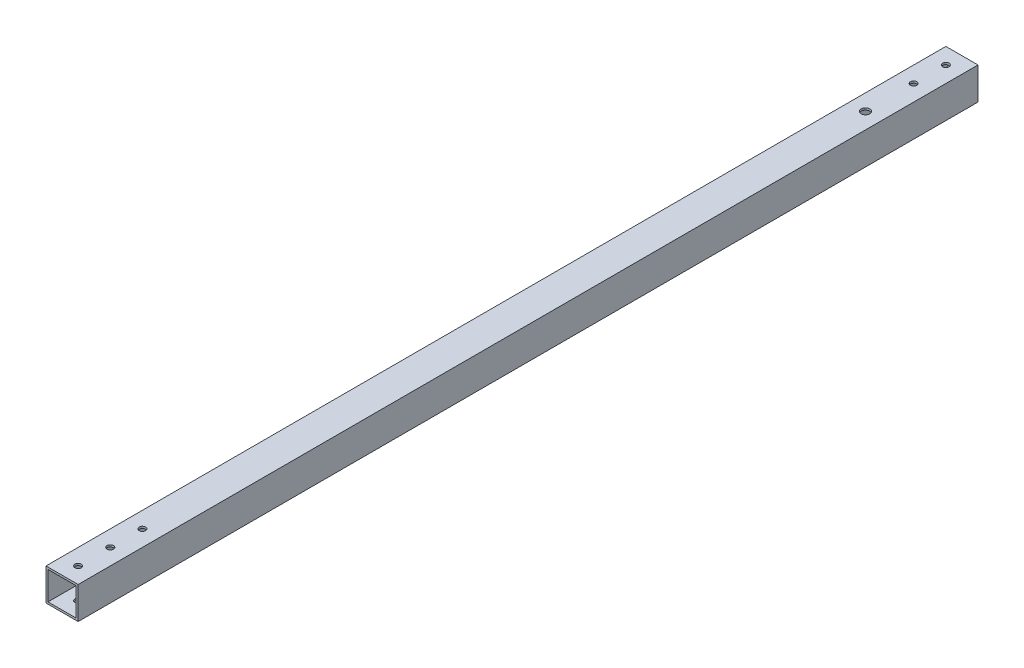
ISO-10303-21;
HEADER;
FILE_DESCRIPTION(('STEP AP214'),'2;1');
FILE_NAME('part.step','',(''),(''),'','','');
FILE_SCHEMA(('AUTOMOTIVE_DESIGN { 1 0 10303 214 1 1 1 1 }'));
ENDSEC;
DATA;
#1=APPLICATION_CONTEXT('core data for automotive mechanical design processes');
#2=APPLICATION_PROTOCOL_DEFINITION('international standard','automotive_design',2000,#1);
#3=PRODUCT_CONTEXT('',#1,'mechanical');
#4=PRODUCT('Part','Part','',(#3));
#5=PRODUCT_RELATED_PRODUCT_CATEGORY('part','',(#4));
#6=PRODUCT_DEFINITION_FORMATION('','',#4);
#7=PRODUCT_DEFINITION_CONTEXT('part definition',#1,'design');
#8=PRODUCT_DEFINITION('design','',#6,#7);
#9=PRODUCT_DEFINITION_SHAPE('','',#8);
#10=(LENGTH_UNIT() NAMED_UNIT(*) SI_UNIT(.MILLI.,.METRE.));
#11=(NAMED_UNIT(*) PLANE_ANGLE_UNIT() SI_UNIT($,.RADIAN.));
#12=(NAMED_UNIT(*) SI_UNIT($,.STERADIAN.) SOLID_ANGLE_UNIT());
#13=UNCERTAINTY_MEASURE_WITH_UNIT(LENGTH_MEASURE(1.E-05),#10,'distance_accuracy_value','');
#14=(GEOMETRIC_REPRESENTATION_CONTEXT(3) GLOBAL_UNCERTAINTY_ASSIGNED_CONTEXT((#13)) GLOBAL_UNIT_ASSIGNED_CONTEXT((#10,
#11,#12)) REPRESENTATION_CONTEXT('',''));
#15=CARTESIAN_POINT('',(0.,0.,0.));
#16=DIRECTION('',(0.,0.,1.));
#17=DIRECTION('',(1.,0.,0.));
#18=AXIS2_PLACEMENT_3D('',#15,#16,#17);
#19=CARTESIAN_POINT('',(0.,0.,711.2));
#20=DIRECTION('',(0.,0.,-1.));
#21=DIRECTION('',(-1.,0.,0.));
#22=AXIS2_PLACEMENT_3D('',#19,#20,#21);
#23=PLANE('',#22);
#24=DIRECTION('',(0.,-1.,0.));
#25=VECTOR('',#24,1.);
#26=CARTESIAN_POINT('',(0.,0.,711.2));
#27=LINE('',#26,#25);
#28=CARTESIAN_POINT('',(0.,25.4,711.2));
#29=VERTEX_POINT('',#28);
#30=CARTESIAN_POINT('',(0.,0.,711.2));
#31=VERTEX_POINT('',#30);
#32=EDGE_CURVE('E157',#29,#31,#27,.T.);
#33=ORIENTED_EDGE('',*,*,#32,.T.);
#34=DIRECTION('',(1.,0.,0.));
#35=VECTOR('',#34,1.);
#36=CARTESIAN_POINT('',(0.,0.,711.2));
#37=LINE('',#36,#35);
#38=CARTESIAN_POINT('',(25.4,0.,711.2));
#39=VERTEX_POINT('',#38);
#40=EDGE_CURVE('E161',#31,#39,#37,.T.);
#41=ORIENTED_EDGE('',*,*,#40,.T.);
#42=DIRECTION('',(0.,1.,0.));
#43=VECTOR('',#42,1.);
#44=CARTESIAN_POINT('',(25.4,0.,711.2));
#45=LINE('',#44,#43);
#46=CARTESIAN_POINT('',(25.4,25.4,711.2));
#47=VERTEX_POINT('',#46);
#48=EDGE_CURVE('E165',#39,#47,#45,.T.);
#49=ORIENTED_EDGE('',*,*,#48,.T.);
#50=DIRECTION('',(-1.,0.,0.));
#51=VECTOR('',#50,1.);
#52=CARTESIAN_POINT('',(0.,25.4,711.2));
#53=LINE('',#52,#51);
#54=EDGE_CURVE('E168',#47,#29,#53,.T.);
#55=ORIENTED_EDGE('',*,*,#54,.T.);
#56=EDGE_LOOP('',(#33,#41,#49,#55));
#57=FACE_BOUND('',#56,.T.);
#58=DIRECTION('',(0.,-1.,0.));
#59=VECTOR('',#58,1.);
#60=CARTESIAN_POINT('',(1.5875,1.5875,711.2));
#61=LINE('',#60,#59);
#62=CARTESIAN_POINT('',(1.5875,23.8125,711.2));
#63=VERTEX_POINT('',#62);
#64=CARTESIAN_POINT('',(1.5875,1.5875,711.2));
#65=VERTEX_POINT('',#64);
#66=EDGE_CURVE('E107',#63,#65,#61,.T.);
#67=ORIENTED_EDGE('',*,*,#66,.F.);
#68=DIRECTION('',(-1.,0.,0.));
#69=VECTOR('',#68,1.);
#70=CARTESIAN_POINT('',(1.5875,23.8125,711.2));
#71=LINE('',#70,#69);
#72=CARTESIAN_POINT('',(23.8125,23.8125,711.2));
#73=VERTEX_POINT('',#72);
#74=EDGE_CURVE('E133',#73,#63,#71,.T.);
#75=ORIENTED_EDGE('',*,*,#74,.F.);
#76=DIRECTION('',(0.,1.,0.));
#77=VECTOR('',#76,1.);
#78=CARTESIAN_POINT('',(23.8125,1.5875,711.2));
#79=LINE('',#78,#77);
#80=CARTESIAN_POINT('',(23.8125,1.5875,711.2));
#81=VERTEX_POINT('',#80);
#82=EDGE_CURVE('E129',#81,#73,#79,.T.);
#83=ORIENTED_EDGE('',*,*,#82,.F.);
#84=DIRECTION('',(1.,0.,0.));
#85=VECTOR('',#84,1.);
#86=CARTESIAN_POINT('',(1.5875,1.5875,711.2));
#87=LINE('',#86,#85);
#88=EDGE_CURVE('E116',#65,#81,#87,.T.);
#89=ORIENTED_EDGE('',*,*,#88,.F.);
#90=EDGE_LOOP('',(#67,#75,#83,#89));
#91=FACE_BOUND('',#90,.T.);
#92=ADVANCED_FACE('F39',(#57,#91),#23,.F.);
#93=CARTESIAN_POINT('',(0.,0.,0.));
#94=DIRECTION('',(0.,0.,-1.));
#95=DIRECTION('',(-1.,0.,0.));
#96=AXIS2_PLACEMENT_3D('',#93,#94,#95);
#97=PLANE('',#96);
#98=DIRECTION('',(0.,-1.,0.));
#99=VECTOR('',#98,1.);
#100=CARTESIAN_POINT('',(0.,0.,0.));
#101=LINE('',#100,#99);
#102=CARTESIAN_POINT('',(0.,25.4,0.));
#103=VERTEX_POINT('',#102);
#104=CARTESIAN_POINT('',(0.,0.,0.));
#105=VERTEX_POINT('',#104);
#106=EDGE_CURVE('E125',#103,#105,#101,.T.);
#107=ORIENTED_EDGE('',*,*,#106,.F.);
#108=DIRECTION('',(-1.,0.,0.));
#109=VECTOR('',#108,1.);
#110=CARTESIAN_POINT('',(0.,25.4,0.));
#111=LINE('',#110,#109);
#112=CARTESIAN_POINT('',(25.4,25.4,0.));
#113=VERTEX_POINT('',#112);
#114=EDGE_CURVE('E162',#113,#103,#111,.T.);
#115=ORIENTED_EDGE('',*,*,#114,.F.);
#116=DIRECTION('',(0.,1.,0.));
#117=VECTOR('',#116,1.);
#118=CARTESIAN_POINT('',(25.4,0.,0.));
#119=LINE('',#118,#117);
#120=CARTESIAN_POINT('',(25.4,0.,0.));
#121=VERTEX_POINT('',#120);
#122=EDGE_CURVE('E178',#121,#113,#119,.T.);
#123=ORIENTED_EDGE('',*,*,#122,.F.);
#124=DIRECTION('',(1.,0.,0.));
#125=VECTOR('',#124,1.);
#126=CARTESIAN_POINT('',(0.,0.,0.));
#127=LINE('',#126,#125);
#128=EDGE_CURVE('E175',#105,#121,#127,.T.);
#129=ORIENTED_EDGE('',*,*,#128,.F.);
#130=EDGE_LOOP('',(#107,#115,#123,#129));
#131=FACE_BOUND('',#130,.T.);
#132=DIRECTION('',(-1.,0.,0.));
#133=VECTOR('',#132,1.);
#134=CARTESIAN_POINT('',(1.5875,23.8125,0.));
#135=LINE('',#134,#133);
#136=CARTESIAN_POINT('',(23.8125,23.8125,0.));
#137=VERTEX_POINT('',#136);
#138=CARTESIAN_POINT('',(1.5875,23.8125,0.));
#139=VERTEX_POINT('',#138);
#140=EDGE_CURVE('E117',#137,#139,#135,.T.);
#141=ORIENTED_EDGE('',*,*,#140,.T.);
#142=DIRECTION('',(0.,-1.,0.));
#143=VECTOR('',#142,1.);
#144=CARTESIAN_POINT('',(1.5875,1.5875,0.));
#145=LINE('',#144,#143);
#146=CARTESIAN_POINT('',(1.5875,1.5875,0.));
#147=VERTEX_POINT('',#146);
#148=EDGE_CURVE('E65',#139,#147,#145,.T.);
#149=ORIENTED_EDGE('',*,*,#148,.T.);
#150=DIRECTION('',(1.,0.,0.));
#151=VECTOR('',#150,1.);
#152=CARTESIAN_POINT('',(1.5875,1.5875,0.));
#153=LINE('',#152,#151);
#154=CARTESIAN_POINT('',(23.8125,1.5875,0.));
#155=VERTEX_POINT('',#154);
#156=EDGE_CURVE('E123',#147,#155,#153,.T.);
#157=ORIENTED_EDGE('',*,*,#156,.T.);
#158=DIRECTION('',(0.,1.,0.));
#159=VECTOR('',#158,1.);
#160=CARTESIAN_POINT('',(23.8125,1.5875,0.));
#161=LINE('',#160,#159);
#162=EDGE_CURVE('E144',#155,#137,#161,.T.);
#163=ORIENTED_EDGE('',*,*,#162,.T.);
#164=EDGE_LOOP('',(#141,#149,#157,#163));
#165=FACE_BOUND('',#164,.T.);
#166=ADVANCED_FACE('F256',(#131,#165),#97,.T.);
#167=CARTESIAN_POINT('',(0.,0.,711.2));
#168=DIRECTION('',(1.,0.,0.));
#169=DIRECTION('',(0.,0.,-1.));
#170=AXIS2_PLACEMENT_3D('',#167,#168,#169);
#171=PLANE('',#170);
#172=ORIENTED_EDGE('',*,*,#106,.T.);
#173=DIRECTION('',(0.,0.,-1.));
#174=VECTOR('',#173,1.);
#175=CARTESIAN_POINT('',(0.,0.,711.2));
#176=LINE('',#175,#174);
#177=EDGE_CURVE('E11',#31,#105,#176,.T.);
#178=ORIENTED_EDGE('',*,*,#177,.F.);
#179=ORIENTED_EDGE('',*,*,#32,.F.);
#180=DIRECTION('',(0.,0.,-1.));
#181=VECTOR('',#180,1.);
#182=CARTESIAN_POINT('',(0.,25.4,711.2));
#183=LINE('',#182,#181);
#184=EDGE_CURVE('E171',#29,#103,#183,.T.);
#185=ORIENTED_EDGE('',*,*,#184,.T.);
#186=EDGE_LOOP('',(#172,#178,#179,#185));
#187=FACE_BOUND('',#186,.T.);
#188=ADVANCED_FACE('F41',(#187),#171,.F.);
#189=CARTESIAN_POINT('',(0.,0.,711.2));
#190=DIRECTION('',(0.,1.,0.));
#191=DIRECTION('',(0.,0.,1.));
#192=AXIS2_PLACEMENT_3D('',#189,#190,#191);
#193=PLANE('',#192);
#194=CARTESIAN_POINT('',(12.7,0.,12.7));
#195=DIRECTION('',(0.,1.,0.));
#196=DIRECTION('',(0.,0.,1.));
#197=AXIS2_PLACEMENT_3D('',#194,#195,#196);
#198=CIRCLE('',#197,2.54);
#199=CARTESIAN_POINT('',(12.7,0.,15.24));
#200=VERTEX_POINT('',#199);
#201=EDGE_CURVE('E198',#200,#200,#198,.T.);
#202=ORIENTED_EDGE('',*,*,#201,.T.);
#203=EDGE_LOOP('',(#202));
#204=FACE_BOUND('',#203,.T.);
#205=CARTESIAN_POINT('',(12.7,0.,76.2));
#206=DIRECTION('',(0.,1.,0.));
#207=DIRECTION('',(0.,0.,1.));
#208=AXIS2_PLACEMENT_3D('',#205,#206,#207);
#209=CIRCLE('',#208,3.42900000000001);
#210=CARTESIAN_POINT('',(12.7,0.,79.629));
#211=VERTEX_POINT('',#210);
#212=EDGE_CURVE('E295',#211,#211,#209,.T.);
#213=ORIENTED_EDGE('',*,*,#212,.T.);
#214=EDGE_LOOP('',(#213));
#215=FACE_BOUND('',#214,.T.);
#216=CARTESIAN_POINT('',(12.7,0.,647.7));
#217=DIRECTION('',(0.,1.,0.));
#218=DIRECTION('',(0.,0.,1.));
#219=AXIS2_PLACEMENT_3D('',#216,#217,#218);
#220=CIRCLE('',#219,2.53999999999992);
#221=CARTESIAN_POINT('',(12.7,0.,650.24));
#222=VERTEX_POINT('',#221);
#223=EDGE_CURVE('E299',#222,#222,#220,.T.);
#224=ORIENTED_EDGE('',*,*,#223,.T.);
#225=EDGE_LOOP('',(#224));
#226=FACE_BOUND('',#225,.T.);
#227=CARTESIAN_POINT('',(12.7,0.,38.1));
#228=DIRECTION('',(0.,1.,0.));
#229=DIRECTION('',(0.,0.,1.));
#230=AXIS2_PLACEMENT_3D('',#227,#228,#229);
#231=CIRCLE('',#230,2.54);
#232=CARTESIAN_POINT('',(12.7,0.,40.64));
#233=VERTEX_POINT('',#232);
#234=EDGE_CURVE('E303',#233,#233,#231,.T.);
#235=ORIENTED_EDGE('',*,*,#234,.T.);
#236=EDGE_LOOP('',(#235));
#237=FACE_BOUND('',#236,.T.);
#238=CARTESIAN_POINT('',(12.7,0.,698.5));
#239=DIRECTION('',(0.,1.,0.));
#240=DIRECTION('',(0.,0.,1.));
#241=AXIS2_PLACEMENT_3D('',#238,#239,#240);
#242=CIRCLE('',#241,2.53999999999992);
#243=CARTESIAN_POINT('',(12.7,0.,701.04));
#244=VERTEX_POINT('',#243);
#245=EDGE_CURVE('E307',#244,#244,#242,.T.);
#246=ORIENTED_EDGE('',*,*,#245,.T.);
#247=EDGE_LOOP('',(#246));
#248=FACE_BOUND('',#247,.T.);
#249=CARTESIAN_POINT('',(12.7,0.,673.1));
#250=DIRECTION('',(0.,1.,0.));
#251=DIRECTION('',(0.,0.,1.));
#252=AXIS2_PLACEMENT_3D('',#249,#250,#251);
#253=CIRCLE('',#252,2.53999999999992);
#254=CARTESIAN_POINT('',(12.7,0.,675.64));
#255=VERTEX_POINT('',#254);
#256=EDGE_CURVE('E311',#255,#255,#253,.T.);
#257=ORIENTED_EDGE('',*,*,#256,.T.);
#258=EDGE_LOOP('',(#257));
#259=FACE_BOUND('',#258,.T.);
#260=ORIENTED_EDGE('',*,*,#128,.T.);
#261=DIRECTION('',(0.,0.,-1.));
#262=VECTOR('',#261,1.);
#263=CARTESIAN_POINT('',(25.4,0.,711.2));
#264=LINE('',#263,#262);
#265=EDGE_CURVE('E49',#39,#121,#264,.T.);
#266=ORIENTED_EDGE('',*,*,#265,.F.);
#267=ORIENTED_EDGE('',*,*,#40,.F.);
#268=ORIENTED_EDGE('',*,*,#177,.T.);
#269=EDGE_LOOP('',(#260,#266,#267,#268));
#270=FACE_BOUND('',#269,.T.);
#271=ADVANCED_FACE('F281',(#204,#215,#226,#237,#248,#259,#270),#193,.F.);
#272=CARTESIAN_POINT('',(25.4,0.,711.2));
#273=DIRECTION('',(-1.,0.,0.));
#274=DIRECTION('',(0.,0.,1.));
#275=AXIS2_PLACEMENT_3D('',#272,#273,#274);
#276=PLANE('',#275);
#277=ORIENTED_EDGE('',*,*,#122,.T.);
#278=DIRECTION('',(0.,0.,-1.));
#279=VECTOR('',#278,1.);
#280=CARTESIAN_POINT('',(25.4,25.4,711.2));
#281=LINE('',#280,#279);
#282=EDGE_CURVE('E186',#47,#113,#281,.T.);
#283=ORIENTED_EDGE('',*,*,#282,.F.);
#284=ORIENTED_EDGE('',*,*,#48,.F.);
#285=ORIENTED_EDGE('',*,*,#265,.T.);
#286=EDGE_LOOP('',(#277,#283,#284,#285));
#287=FACE_BOUND('',#286,.T.);
#288=ADVANCED_FACE('F278',(#287),#276,.F.);
#289=CARTESIAN_POINT('',(0.,25.4,711.2));
#290=DIRECTION('',(0.,-1.,0.));
#291=DIRECTION('',(0.,0.,-1.));
#292=AXIS2_PLACEMENT_3D('',#289,#290,#291);
#293=PLANE('',#292);
#294=CARTESIAN_POINT('',(12.7,25.4,12.7));
#295=DIRECTION('',(0.,1.,0.));
#296=DIRECTION('',(0.,0.,1.));
#297=AXIS2_PLACEMENT_3D('',#294,#295,#296);
#298=CIRCLE('',#297,2.54);
#299=CARTESIAN_POINT('',(12.7,25.4,15.24));
#300=VERTEX_POINT('',#299);
#301=EDGE_CURVE('E325',#300,#300,#298,.T.);
#302=ORIENTED_EDGE('',*,*,#301,.F.);
#303=EDGE_LOOP('',(#302));
#304=FACE_BOUND('',#303,.T.);
#305=CARTESIAN_POINT('',(12.7,25.4,76.2));
#306=DIRECTION('',(0.,1.,0.));
#307=DIRECTION('',(0.,0.,1.));
#308=AXIS2_PLACEMENT_3D('',#305,#306,#307);
#309=CIRCLE('',#308,3.42900000000001);
#310=CARTESIAN_POINT('',(12.7,25.4,79.629));
#311=VERTEX_POINT('',#310);
#312=EDGE_CURVE('E335',#311,#311,#309,.T.);
#313=ORIENTED_EDGE('',*,*,#312,.F.);
#314=EDGE_LOOP('',(#313));
#315=FACE_BOUND('',#314,.T.);
#316=CARTESIAN_POINT('',(12.7,25.4,647.7));
#317=DIRECTION('',(0.,1.,0.));
#318=DIRECTION('',(0.,0.,1.));
#319=AXIS2_PLACEMENT_3D('',#316,#317,#318);
#320=CIRCLE('',#319,2.53999999999992);
#321=CARTESIAN_POINT('',(12.7,25.4,650.24));
#322=VERTEX_POINT('',#321);
#323=EDGE_CURVE('E352',#322,#322,#320,.T.);
#324=ORIENTED_EDGE('',*,*,#323,.F.);
#325=EDGE_LOOP('',(#324));
#326=FACE_BOUND('',#325,.T.);
#327=CARTESIAN_POINT('',(12.7,25.4,38.1));
#328=DIRECTION('',(0.,1.,0.));
#329=DIRECTION('',(0.,0.,1.));
#330=AXIS2_PLACEMENT_3D('',#327,#328,#329);
#331=CIRCLE('',#330,2.54);
#332=CARTESIAN_POINT('',(12.7,25.4,40.64));
#333=VERTEX_POINT('',#332);
#334=EDGE_CURVE('E346',#333,#333,#331,.T.);
#335=ORIENTED_EDGE('',*,*,#334,.F.);
#336=EDGE_LOOP('',(#335));
#337=FACE_BOUND('',#336,.T.);
#338=CARTESIAN_POINT('',(12.7,25.4,698.5));
#339=DIRECTION('',(0.,1.,0.));
#340=DIRECTION('',(0.,0.,1.));
#341=AXIS2_PLACEMENT_3D('',#338,#339,#340);
#342=CIRCLE('',#341,2.53999999999992);
#343=CARTESIAN_POINT('',(12.7,25.4,701.04));
#344=VERTEX_POINT('',#343);
#345=EDGE_CURVE('E340',#344,#344,#342,.T.);
#346=ORIENTED_EDGE('',*,*,#345,.F.);
#347=EDGE_LOOP('',(#346));
#348=FACE_BOUND('',#347,.T.);
#349=CARTESIAN_POINT('',(12.7,25.4,673.1));
#350=DIRECTION('',(0.,1.,0.));
#351=DIRECTION('',(0.,0.,1.));
#352=AXIS2_PLACEMENT_3D('',#349,#350,#351);
#353=CIRCLE('',#352,2.53999999999992);
#354=CARTESIAN_POINT('',(12.7,25.4,675.64));
#355=VERTEX_POINT('',#354);
#356=EDGE_CURVE('E326',#355,#355,#353,.T.);
#357=ORIENTED_EDGE('',*,*,#356,.F.);
#358=EDGE_LOOP('',(#357));
#359=FACE_BOUND('',#358,.T.);
#360=ORIENTED_EDGE('',*,*,#114,.T.);
#361=ORIENTED_EDGE('',*,*,#184,.F.);
#362=ORIENTED_EDGE('',*,*,#54,.F.);
#363=ORIENTED_EDGE('',*,*,#282,.T.);
#364=EDGE_LOOP('',(#360,#361,#362,#363));
#365=FACE_BOUND('',#364,.T.);
#366=ADVANCED_FACE('F275',(#304,#315,#326,#337,#348,#359,#365),#293,.F.);
#367=CARTESIAN_POINT('',(1.5875,1.5875,711.2));
#368=DIRECTION('',(1.,0.,0.));
#369=DIRECTION('',(0.,0.,-1.));
#370=AXIS2_PLACEMENT_3D('',#367,#368,#369);
#371=PLANE('',#370);
#372=ORIENTED_EDGE('',*,*,#148,.F.);
#373=DIRECTION('',(0.,0.,-1.));
#374=VECTOR('',#373,1.);
#375=CARTESIAN_POINT('',(1.5875,23.8125,711.2));
#376=LINE('',#375,#374);
#377=EDGE_CURVE('E111',#63,#139,#376,.T.);
#378=ORIENTED_EDGE('',*,*,#377,.F.);
#379=ORIENTED_EDGE('',*,*,#66,.T.);
#380=DIRECTION('',(0.,0.,-1.));
#381=VECTOR('',#380,1.);
#382=CARTESIAN_POINT('',(1.5875,1.5875,711.2));
#383=LINE('',#382,#381);
#384=EDGE_CURVE('E110',#65,#147,#383,.T.);
#385=ORIENTED_EDGE('',*,*,#384,.T.);
#386=EDGE_LOOP('',(#372,#378,#379,#385));
#387=FACE_BOUND('',#386,.T.);
#388=ADVANCED_FACE('F109',(#387),#371,.T.);
#389=CARTESIAN_POINT('',(1.5875,1.5875,711.2));
#390=DIRECTION('',(0.,1.,0.));
#391=DIRECTION('',(0.,0.,1.));
#392=AXIS2_PLACEMENT_3D('',#389,#390,#391);
#393=PLANE('',#392);
#394=CARTESIAN_POINT('',(12.7,1.5875,12.7));
#395=DIRECTION('',(0.,1.,0.));
#396=DIRECTION('',(0.,0.,1.));
#397=AXIS2_PLACEMENT_3D('',#394,#395,#396);
#398=CIRCLE('',#397,2.54);
#399=CARTESIAN_POINT('',(12.7,1.5875,15.24));
#400=VERTEX_POINT('',#399);
#401=EDGE_CURVE('E141',#400,#400,#398,.T.);
#402=ORIENTED_EDGE('',*,*,#401,.F.);
#403=EDGE_LOOP('',(#402));
#404=FACE_BOUND('',#403,.T.);
#405=CARTESIAN_POINT('',(12.7,1.5875,76.2));
#406=DIRECTION('',(0.,1.,0.));
#407=DIRECTION('',(0.,0.,1.));
#408=AXIS2_PLACEMENT_3D('',#405,#406,#407);
#409=CIRCLE('',#408,3.42900000000001);
#410=CARTESIAN_POINT('',(12.7,1.5875,79.629));
#411=VERTEX_POINT('',#410);
#412=EDGE_CURVE('E216',#411,#411,#409,.T.);
#413=ORIENTED_EDGE('',*,*,#412,.F.);
#414=EDGE_LOOP('',(#413));
#415=FACE_BOUND('',#414,.T.);
#416=CARTESIAN_POINT('',(12.7,1.5875,647.7));
#417=DIRECTION('',(0.,1.,0.));
#418=DIRECTION('',(0.,0.,1.));
#419=AXIS2_PLACEMENT_3D('',#416,#417,#418);
#420=CIRCLE('',#419,2.53999999999992);
#421=CARTESIAN_POINT('',(12.7,1.5875,650.24));
#422=VERTEX_POINT('',#421);
#423=EDGE_CURVE('E212',#422,#422,#420,.T.);
#424=ORIENTED_EDGE('',*,*,#423,.F.);
#425=EDGE_LOOP('',(#424));
#426=FACE_BOUND('',#425,.T.);
#427=CARTESIAN_POINT('',(12.7,1.5875,38.1));
#428=DIRECTION('',(0.,1.,0.));
#429=DIRECTION('',(0.,0.,1.));
#430=AXIS2_PLACEMENT_3D('',#427,#428,#429);
#431=CIRCLE('',#430,2.54);
#432=CARTESIAN_POINT('',(12.7,1.5875,40.64));
#433=VERTEX_POINT('',#432);
#434=EDGE_CURVE('E208',#433,#433,#431,.T.);
#435=ORIENTED_EDGE('',*,*,#434,.F.);
#436=EDGE_LOOP('',(#435));
#437=FACE_BOUND('',#436,.T.);
#438=CARTESIAN_POINT('',(12.7,1.5875,698.5));
#439=DIRECTION('',(0.,1.,0.));
#440=DIRECTION('',(0.,0.,1.));
#441=AXIS2_PLACEMENT_3D('',#438,#439,#440);
#442=CIRCLE('',#441,2.53999999999992);
#443=CARTESIAN_POINT('',(12.7,1.5875,701.04));
#444=VERTEX_POINT('',#443);
#445=EDGE_CURVE('E203',#444,#444,#442,.T.);
#446=ORIENTED_EDGE('',*,*,#445,.F.);
#447=EDGE_LOOP('',(#446));
#448=FACE_BOUND('',#447,.T.);
#449=CARTESIAN_POINT('',(12.7,1.5875,673.1));
#450=DIRECTION('',(0.,1.,0.));
#451=DIRECTION('',(0.,0.,1.));
#452=AXIS2_PLACEMENT_3D('',#449,#450,#451);
#453=CIRCLE('',#452,2.53999999999992);
#454=CARTESIAN_POINT('',(12.7,1.5875,675.64));
#455=VERTEX_POINT('',#454);
#456=EDGE_CURVE('E197',#455,#455,#453,.T.);
#457=ORIENTED_EDGE('',*,*,#456,.F.);
#458=EDGE_LOOP('',(#457));
#459=FACE_BOUND('',#458,.T.);
#460=ORIENTED_EDGE('',*,*,#156,.F.);
#461=ORIENTED_EDGE('',*,*,#384,.F.);
#462=ORIENTED_EDGE('',*,*,#88,.T.);
#463=DIRECTION('',(0.,0.,-1.));
#464=VECTOR('',#463,1.);
#465=CARTESIAN_POINT('',(23.8125,1.5875,711.2));
#466=LINE('',#465,#464);
#467=EDGE_CURVE('E126',#81,#155,#466,.T.);
#468=ORIENTED_EDGE('',*,*,#467,.T.);
#469=EDGE_LOOP('',(#460,#461,#462,#468));
#470=FACE_BOUND('',#469,.T.);
#471=ADVANCED_FACE('F120',(#404,#415,#426,#437,#448,#459,#470),#393,.T.);
#472=CARTESIAN_POINT('',(23.8125,1.5875,711.2));
#473=DIRECTION('',(-1.,0.,0.));
#474=DIRECTION('',(0.,0.,1.));
#475=AXIS2_PLACEMENT_3D('',#472,#473,#474);
#476=PLANE('',#475);
#477=ORIENTED_EDGE('',*,*,#162,.F.);
#478=ORIENTED_EDGE('',*,*,#467,.F.);
#479=ORIENTED_EDGE('',*,*,#82,.T.);
#480=DIRECTION('',(0.,0.,-1.));
#481=VECTOR('',#480,1.);
#482=CARTESIAN_POINT('',(23.8125,23.8125,711.2));
#483=LINE('',#482,#481);
#484=EDGE_CURVE('E57',#73,#137,#483,.T.);
#485=ORIENTED_EDGE('',*,*,#484,.T.);
#486=EDGE_LOOP('',(#477,#478,#479,#485));
#487=FACE_BOUND('',#486,.T.);
#488=ADVANCED_FACE('F244',(#487),#476,.T.);
#489=CARTESIAN_POINT('',(1.5875,23.8125,711.2));
#490=DIRECTION('',(0.,-1.,0.));
#491=DIRECTION('',(0.,0.,-1.));
#492=AXIS2_PLACEMENT_3D('',#489,#490,#491);
#493=PLANE('',#492);
#494=CARTESIAN_POINT('',(12.7,23.8125,12.7));
#495=DIRECTION('',(0.,-1.,0.));
#496=DIRECTION('',(0.,0.,-1.));
#497=AXIS2_PLACEMENT_3D('',#494,#495,#496);
#498=CIRCLE('',#497,2.54);
#499=CARTESIAN_POINT('',(12.7,23.8125,10.16));
#500=VERTEX_POINT('',#499);
#501=EDGE_CURVE('E43',#500,#500,#498,.T.);
#502=ORIENTED_EDGE('',*,*,#501,.F.);
#503=EDGE_LOOP('',(#502));
#504=FACE_BOUND('',#503,.T.);
#505=CARTESIAN_POINT('',(12.7,23.8125,76.2));
#506=DIRECTION('',(0.,-1.,0.));
#507=DIRECTION('',(0.,0.,-1.));
#508=AXIS2_PLACEMENT_3D('',#505,#506,#507);
#509=CIRCLE('',#508,3.42900000000001);
#510=CARTESIAN_POINT('',(12.7,23.8125,72.771));
#511=VERTEX_POINT('',#510);
#512=EDGE_CURVE('E213',#511,#511,#509,.T.);
#513=ORIENTED_EDGE('',*,*,#512,.F.);
#514=EDGE_LOOP('',(#513));
#515=FACE_BOUND('',#514,.T.);
#516=CARTESIAN_POINT('',(12.7,23.8125,647.7));
#517=DIRECTION('',(0.,-1.,0.));
#518=DIRECTION('',(0.,0.,-1.));
#519=AXIS2_PLACEMENT_3D('',#516,#517,#518);
#520=CIRCLE('',#519,2.53999999999992);
#521=CARTESIAN_POINT('',(12.7,23.8125,645.16));
#522=VERTEX_POINT('',#521);
#523=EDGE_CURVE('E209',#522,#522,#520,.T.);
#524=ORIENTED_EDGE('',*,*,#523,.F.);
#525=EDGE_LOOP('',(#524));
#526=FACE_BOUND('',#525,.T.);
#527=CARTESIAN_POINT('',(12.7,23.8125,38.1));
#528=DIRECTION('',(0.,-1.,0.));
#529=DIRECTION('',(0.,0.,-1.));
#530=AXIS2_PLACEMENT_3D('',#527,#528,#529);
#531=CIRCLE('',#530,2.54);
#532=CARTESIAN_POINT('',(12.7,23.8125,35.56));
#533=VERTEX_POINT('',#532);
#534=EDGE_CURVE('E204',#533,#533,#531,.T.);
#535=ORIENTED_EDGE('',*,*,#534,.F.);
#536=EDGE_LOOP('',(#535));
#537=FACE_BOUND('',#536,.T.);
#538=CARTESIAN_POINT('',(12.7,23.8125,698.5));
#539=DIRECTION('',(0.,-1.,0.));
#540=DIRECTION('',(0.,0.,-1.));
#541=AXIS2_PLACEMENT_3D('',#538,#539,#540);
#542=CIRCLE('',#541,2.53999999999992);
#543=CARTESIAN_POINT('',(12.7,23.8125,695.96));
#544=VERTEX_POINT('',#543);
#545=EDGE_CURVE('E199',#544,#544,#542,.T.);
#546=ORIENTED_EDGE('',*,*,#545,.F.);
#547=EDGE_LOOP('',(#546));
#548=FACE_BOUND('',#547,.T.);
#549=CARTESIAN_POINT('',(12.7,23.8125,673.1));
#550=DIRECTION('',(0.,-1.,0.));
#551=DIRECTION('',(0.,0.,-1.));
#552=AXIS2_PLACEMENT_3D('',#549,#550,#551);
#553=CIRCLE('',#552,2.53999999999992);
#554=CARTESIAN_POINT('',(12.7,23.8125,670.56));
#555=VERTEX_POINT('',#554);
#556=EDGE_CURVE('E193',#555,#555,#553,.T.);
#557=ORIENTED_EDGE('',*,*,#556,.F.);
#558=EDGE_LOOP('',(#557));
#559=FACE_BOUND('',#558,.T.);
#560=ORIENTED_EDGE('',*,*,#140,.F.);
#561=ORIENTED_EDGE('',*,*,#484,.F.);
#562=ORIENTED_EDGE('',*,*,#74,.T.);
#563=ORIENTED_EDGE('',*,*,#377,.T.);
#564=EDGE_LOOP('',(#560,#561,#562,#563));
#565=FACE_BOUND('',#564,.T.);
#566=ADVANCED_FACE('F240',(#504,#515,#526,#537,#548,#559,#565),#493,.T.);
#567=CARTESIAN_POINT('',(12.7,0.,673.1));
#568=DIRECTION('',(0.,1.,0.));
#569=DIRECTION('',(0.,0.,1.));
#570=AXIS2_PLACEMENT_3D('',#567,#568,#569);
#571=CYLINDRICAL_SURFACE('',#570,2.53999999999992);
#572=ORIENTED_EDGE('',*,*,#556,.T.);
#573=EDGE_LOOP('',(#572));
#574=FACE_BOUND('',#573,.T.);
#575=ORIENTED_EDGE('',*,*,#356,.T.);
#576=EDGE_LOOP('',(#575));
#577=FACE_BOUND('',#576,.T.);
#578=ADVANCED_FACE('F243',(#574,#577),#571,.F.);
#579=CARTESIAN_POINT('',(12.7,0.,698.5));
#580=DIRECTION('',(0.,1.,0.));
#581=DIRECTION('',(0.,0.,1.));
#582=AXIS2_PLACEMENT_3D('',#579,#580,#581);
#583=CYLINDRICAL_SURFACE('',#582,2.53999999999992);
#584=ORIENTED_EDGE('',*,*,#545,.T.);
#585=EDGE_LOOP('',(#584));
#586=FACE_BOUND('',#585,.T.);
#587=ORIENTED_EDGE('',*,*,#345,.T.);
#588=EDGE_LOOP('',(#587));
#589=FACE_BOUND('',#588,.T.);
#590=ADVANCED_FACE('F377',(#586,#589),#583,.F.);
#591=CARTESIAN_POINT('',(12.7,0.,38.1));
#592=DIRECTION('',(0.,1.,0.));
#593=DIRECTION('',(0.,0.,1.));
#594=AXIS2_PLACEMENT_3D('',#591,#592,#593);
#595=CYLINDRICAL_SURFACE('',#594,2.54);
#596=ORIENTED_EDGE('',*,*,#534,.T.);
#597=EDGE_LOOP('',(#596));
#598=FACE_BOUND('',#597,.T.);
#599=ORIENTED_EDGE('',*,*,#334,.T.);
#600=EDGE_LOOP('',(#599));
#601=FACE_BOUND('',#600,.T.);
#602=ADVANCED_FACE('F387',(#598,#601),#595,.F.);
#603=CARTESIAN_POINT('',(12.7,0.,647.7));
#604=DIRECTION('',(0.,1.,0.));
#605=DIRECTION('',(0.,0.,1.));
#606=AXIS2_PLACEMENT_3D('',#603,#604,#605);
#607=CYLINDRICAL_SURFACE('',#606,2.53999999999992);
#608=ORIENTED_EDGE('',*,*,#523,.T.);
#609=EDGE_LOOP('',(#608));
#610=FACE_BOUND('',#609,.T.);
#611=ORIENTED_EDGE('',*,*,#323,.T.);
#612=EDGE_LOOP('',(#611));
#613=FACE_BOUND('',#612,.T.);
#614=ADVANCED_FACE('F395',(#610,#613),#607,.F.);
#615=CARTESIAN_POINT('',(12.7,0.,76.2));
#616=DIRECTION('',(0.,1.,0.));
#617=DIRECTION('',(0.,0.,1.));
#618=AXIS2_PLACEMENT_3D('',#615,#616,#617);
#619=CYLINDRICAL_SURFACE('',#618,3.42900000000001);
#620=ORIENTED_EDGE('',*,*,#512,.T.);
#621=EDGE_LOOP('',(#620));
#622=FACE_BOUND('',#621,.T.);
#623=ORIENTED_EDGE('',*,*,#312,.T.);
#624=EDGE_LOOP('',(#623));
#625=FACE_BOUND('',#624,.T.);
#626=ADVANCED_FACE('F378',(#622,#625),#619,.F.);
#627=CARTESIAN_POINT('',(12.7,0.,12.7));
#628=DIRECTION('',(0.,1.,0.));
#629=DIRECTION('',(0.,0.,1.));
#630=AXIS2_PLACEMENT_3D('',#627,#628,#629);
#631=CYLINDRICAL_SURFACE('',#630,2.54);
#632=ORIENTED_EDGE('',*,*,#501,.T.);
#633=EDGE_LOOP('',(#632));
#634=FACE_BOUND('',#633,.T.);
#635=ORIENTED_EDGE('',*,*,#301,.T.);
#636=EDGE_LOOP('',(#635));
#637=FACE_BOUND('',#636,.T.);
#638=ADVANCED_FACE('F237',(#634,#637),#631,.F.);
#639=ORIENTED_EDGE('',*,*,#456,.T.);
#640=EDGE_LOOP('',(#639));
#641=FACE_BOUND('',#640,.T.);
#642=ORIENTED_EDGE('',*,*,#256,.F.);
#643=EDGE_LOOP('',(#642));
#644=FACE_BOUND('',#643,.T.);
#645=ADVANCED_FACE('F368',(#641,#644),#571,.F.);
#646=ORIENTED_EDGE('',*,*,#445,.T.);
#647=EDGE_LOOP('',(#646));
#648=FACE_BOUND('',#647,.T.);
#649=ORIENTED_EDGE('',*,*,#245,.F.);
#650=EDGE_LOOP('',(#649));
#651=FACE_BOUND('',#650,.T.);
#652=ADVANCED_FACE('F362',(#648,#651),#583,.F.);
#653=ORIENTED_EDGE('',*,*,#434,.T.);
#654=EDGE_LOOP('',(#653));
#655=FACE_BOUND('',#654,.T.);
#656=ORIENTED_EDGE('',*,*,#234,.F.);
#657=EDGE_LOOP('',(#656));
#658=FACE_BOUND('',#657,.T.);
#659=ADVANCED_FACE('F375',(#655,#658),#595,.F.);
#660=ORIENTED_EDGE('',*,*,#423,.T.);
#661=EDGE_LOOP('',(#660));
#662=FACE_BOUND('',#661,.T.);
#663=ORIENTED_EDGE('',*,*,#223,.F.);
#664=EDGE_LOOP('',(#663));
#665=FACE_BOUND('',#664,.T.);
#666=ADVANCED_FACE('F402',(#662,#665),#607,.F.);
#667=ORIENTED_EDGE('',*,*,#412,.T.);
#668=EDGE_LOOP('',(#667));
#669=FACE_BOUND('',#668,.T.);
#670=ORIENTED_EDGE('',*,*,#212,.F.);
#671=EDGE_LOOP('',(#670));
#672=FACE_BOUND('',#671,.T.);
#673=ADVANCED_FACE('F406',(#669,#672),#619,.F.);
#674=ORIENTED_EDGE('',*,*,#401,.T.);
#675=EDGE_LOOP('',(#674));
#676=FACE_BOUND('',#675,.T.);
#677=ORIENTED_EDGE('',*,*,#201,.F.);
#678=EDGE_LOOP('',(#677));
#679=FACE_BOUND('',#678,.T.);
#680=ADVANCED_FACE('F380',(#676,#679),#631,.F.);
#681=CLOSED_SHELL('',(#92,#166,#188,#271,#288,#366,#388,#471,#488,#566,#578,#590,#602,#614,#626,
#638,#645,#652,#659,#666,#673,#680));
#682=MANIFOLD_SOLID_BREP('B2',#681);
#683=ADVANCED_BREP_SHAPE_REPRESENTATION('',(#18,#682),#14);
#684=SHAPE_DEFINITION_REPRESENTATION(#9,#683);
ENDSEC;
END-ISO-10303-21;
